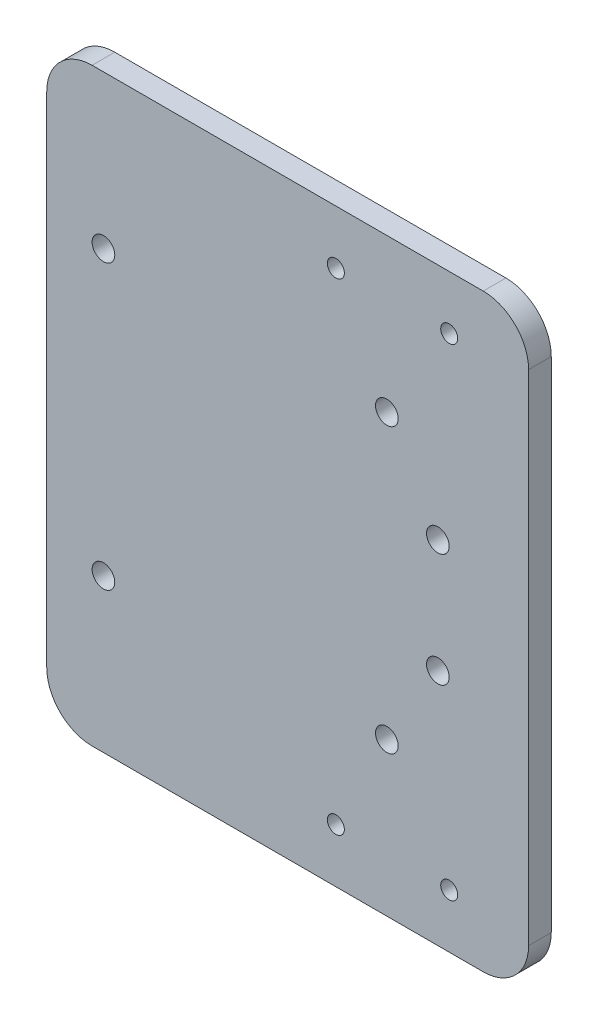
ISO-10303-21;
HEADER;
FILE_DESCRIPTION(('STEP AP214'),'2;1');
FILE_NAME('part.step','',(''),(''),'','','');
FILE_SCHEMA(('AUTOMOTIVE_DESIGN { 1 0 10303 214 1 1 1 1 }'));
ENDSEC;
DATA;
#1=APPLICATION_CONTEXT('core data for automotive mechanical design processes');
#2=APPLICATION_PROTOCOL_DEFINITION('international standard','automotive_design',2000,#1);
#3=PRODUCT_CONTEXT('',#1,'mechanical');
#4=PRODUCT('Part','Part','',(#3));
#5=PRODUCT_RELATED_PRODUCT_CATEGORY('part','',(#4));
#6=PRODUCT_DEFINITION_FORMATION('','',#4);
#7=PRODUCT_DEFINITION_CONTEXT('part definition',#1,'design');
#8=PRODUCT_DEFINITION('design','',#6,#7);
#9=PRODUCT_DEFINITION_SHAPE('','',#8);
#10=(LENGTH_UNIT() NAMED_UNIT(*) SI_UNIT(.MILLI.,.METRE.));
#11=(NAMED_UNIT(*) PLANE_ANGLE_UNIT() SI_UNIT($,.RADIAN.));
#12=(NAMED_UNIT(*) SI_UNIT($,.STERADIAN.) SOLID_ANGLE_UNIT());
#13=UNCERTAINTY_MEASURE_WITH_UNIT(LENGTH_MEASURE(1.E-05),#10,'distance_accuracy_value','');
#14=(GEOMETRIC_REPRESENTATION_CONTEXT(3) GLOBAL_UNCERTAINTY_ASSIGNED_CONTEXT((#13)) GLOBAL_UNIT_ASSIGNED_CONTEXT((#10,
#11,#12)) REPRESENTATION_CONTEXT('',''));
#15=CARTESIAN_POINT('',(0.,0.,0.));
#16=DIRECTION('',(0.,0.,1.));
#17=DIRECTION('',(1.,0.,0.));
#18=AXIS2_PLACEMENT_3D('',#15,#16,#17);
#19=CARTESIAN_POINT('',(28.8997114117527,0.,4.));
#20=DIRECTION('',(1.,0.,0.));
#21=DIRECTION('',(0.,1.,0.));
#22=AXIS2_PLACEMENT_3D('',#19,#20,#21);
#23=PLANE('',#22);
#24=DIRECTION('',(0.,-1.,0.));
#25=VECTOR('',#24,1.);
#26=CARTESIAN_POINT('',(28.8997114117527,0.,4.));
#27=LINE('',#26,#25);
#28=CARTESIAN_POINT('',(28.8997114117527,33.4797256667239,4.));
#29=VERTEX_POINT('',#28);
#30=CARTESIAN_POINT('',(28.8997114117527,-54.520274333276,4.));
#31=VERTEX_POINT('',#30);
#32=EDGE_CURVE('E163',#29,#31,#27,.T.);
#33=ORIENTED_EDGE('',*,*,#32,.T.);
#34=DIRECTION('',(0.,0.,-1.));
#35=VECTOR('',#34,1.);
#36=CARTESIAN_POINT('',(28.8997114117527,-54.520274333276,0.));
#37=LINE('',#36,#35);
#38=CARTESIAN_POINT('',(28.8997114117527,-54.520274333276,0.));
#39=VERTEX_POINT('',#38);
#40=EDGE_CURVE('E155',#31,#39,#37,.T.);
#41=ORIENTED_EDGE('',*,*,#40,.T.);
#42=DIRECTION('',(0.,-1.,0.));
#43=VECTOR('',#42,1.);
#44=CARTESIAN_POINT('',(28.8997114117527,0.,0.));
#45=LINE('',#44,#43);
#46=CARTESIAN_POINT('',(28.8997114117527,33.4797256667239,0.));
#47=VERTEX_POINT('',#46);
#48=EDGE_CURVE('E161',#47,#39,#45,.T.);
#49=ORIENTED_EDGE('',*,*,#48,.F.);
#50=DIRECTION('',(0.,0.,-1.));
#51=VECTOR('',#50,1.);
#52=CARTESIAN_POINT('',(28.8997114117527,33.4797256667239,4.));
#53=LINE('',#52,#51);
#54=EDGE_CURVE('E153',#47,#29,#53,.F.);
#55=ORIENTED_EDGE('',*,*,#54,.T.);
#56=EDGE_LOOP('',(#33,#41,#49,#55));
#57=FACE_BOUND('',#56,.T.);
#58=ADVANCED_FACE('F36',(#57),#23,.T.);
#59=CARTESIAN_POINT('',(0.,41.4797256667239,4.));
#60=DIRECTION('',(0.,1.,0.));
#61=DIRECTION('',(0.,0.,1.));
#62=AXIS2_PLACEMENT_3D('',#59,#60,#61);
#63=PLANE('',#62);
#64=DIRECTION('',(1.,0.,0.));
#65=VECTOR('',#64,1.);
#66=CARTESIAN_POINT('',(0.,41.4797256667239,4.));
#67=LINE('',#66,#65);
#68=CARTESIAN_POINT('',(-48.1002885882473,41.4797256667239,4.));
#69=VERTEX_POINT('',#68);
#70=CARTESIAN_POINT('',(20.8997114117527,41.4797256667239,4.));
#71=VERTEX_POINT('',#70);
#72=EDGE_CURVE('E203',#69,#71,#67,.T.);
#73=ORIENTED_EDGE('',*,*,#72,.T.);
#74=DIRECTION('',(0.,0.,-1.));
#75=VECTOR('',#74,1.);
#76=CARTESIAN_POINT('',(20.8997114117527,41.4797256667239,4.));
#77=LINE('',#76,#75);
#78=CARTESIAN_POINT('',(20.8997114117527,41.4797256667239,0.));
#79=VERTEX_POINT('',#78);
#80=EDGE_CURVE('E11',#71,#79,#77,.T.);
#81=ORIENTED_EDGE('',*,*,#80,.T.);
#82=DIRECTION('',(1.,0.,0.));
#83=VECTOR('',#82,1.);
#84=CARTESIAN_POINT('',(0.,41.4797256667239,0.));
#85=LINE('',#84,#83);
#86=CARTESIAN_POINT('',(-48.1002885882473,41.4797256667239,0.));
#87=VERTEX_POINT('',#86);
#88=EDGE_CURVE('E134',#87,#79,#85,.T.);
#89=ORIENTED_EDGE('',*,*,#88,.F.);
#90=DIRECTION('',(0.,0.,-1.));
#91=VECTOR('',#90,1.);
#92=CARTESIAN_POINT('',(-48.1002885882473,41.4797256667239,4.));
#93=LINE('',#92,#91);
#94=EDGE_CURVE('E44',#87,#69,#93,.F.);
#95=ORIENTED_EDGE('',*,*,#94,.T.);
#96=EDGE_LOOP('',(#73,#81,#89,#95));
#97=FACE_BOUND('',#96,.T.);
#98=ADVANCED_FACE('F262',(#97),#63,.T.);
#99=CARTESIAN_POINT('',(-56.1002885882473,0.,4.));
#100=DIRECTION('',(1.,0.,0.));
#101=DIRECTION('',(0.,0.,-1.));
#102=AXIS2_PLACEMENT_3D('',#99,#100,#101);
#103=PLANE('',#102);
#104=DIRECTION('',(0.,-1.,0.));
#105=VECTOR('',#104,1.);
#106=CARTESIAN_POINT('',(-56.1002885882473,0.,0.));
#107=LINE('',#106,#105);
#108=CARTESIAN_POINT('',(-56.1002885882473,33.4797256667239,0.));
#109=VERTEX_POINT('',#108);
#110=CARTESIAN_POINT('',(-56.1002885882473,-54.520274333276,0.));
#111=VERTEX_POINT('',#110);
#112=EDGE_CURVE('E129',#109,#111,#107,.T.);
#113=ORIENTED_EDGE('',*,*,#112,.T.);
#114=DIRECTION('',(0.,0.,-1.));
#115=VECTOR('',#114,1.);
#116=CARTESIAN_POINT('',(-56.1002885882473,-54.520274333276,4.));
#117=LINE('',#116,#115);
#118=CARTESIAN_POINT('',(-56.1002885882473,-54.520274333276,4.));
#119=VERTEX_POINT('',#118);
#120=EDGE_CURVE('E107',#111,#119,#117,.F.);
#121=ORIENTED_EDGE('',*,*,#120,.T.);
#122=DIRECTION('',(0.,-1.,0.));
#123=VECTOR('',#122,1.);
#124=CARTESIAN_POINT('',(-56.1002885882473,0.,4.));
#125=LINE('',#124,#123);
#126=CARTESIAN_POINT('',(-56.1002885882473,33.4797256667239,4.));
#127=VERTEX_POINT('',#126);
#128=EDGE_CURVE('E200',#127,#119,#125,.T.);
#129=ORIENTED_EDGE('',*,*,#128,.F.);
#130=DIRECTION('',(0.,0.,-1.));
#131=VECTOR('',#130,1.);
#132=CARTESIAN_POINT('',(-56.1002885882473,33.4797256667239,0.));
#133=LINE('',#132,#131);
#134=EDGE_CURVE('E112',#127,#109,#133,.T.);
#135=ORIENTED_EDGE('',*,*,#134,.T.);
#136=EDGE_LOOP('',(#113,#121,#129,#135));
#137=FACE_BOUND('',#136,.T.);
#138=ADVANCED_FACE('F260',(#137),#103,.F.);
#139=CARTESIAN_POINT('',(-5.10028858824732,31.979725666724,4.));
#140=DIRECTION('',(0.,0.,-1.));
#141=DIRECTION('',(-1.,0.,0.));
#142=AXIS2_PLACEMENT_3D('',#139,#140,#141);
#143=CYLINDRICAL_SURFACE('',#142,1.5);
#144=CARTESIAN_POINT('',(-5.10028858824732,31.979725666724,4.));
#145=DIRECTION('',(0.,0.,1.));
#146=DIRECTION('',(1.,0.,0.));
#147=AXIS2_PLACEMENT_3D('',#144,#145,#146);
#148=CIRCLE('',#147,1.5);
#149=CARTESIAN_POINT('',(-3.60028858824732,31.979725666724,4.));
#150=VERTEX_POINT('',#149);
#151=EDGE_CURVE('E206',#150,#150,#148,.T.);
#152=ORIENTED_EDGE('',*,*,#151,.T.);
#153=EDGE_LOOP('',(#152));
#154=FACE_BOUND('',#153,.T.);
#155=CARTESIAN_POINT('',(-5.10028858824732,31.979725666724,0.));
#156=DIRECTION('',(0.,0.,1.));
#157=DIRECTION('',(1.,0.,0.));
#158=AXIS2_PLACEMENT_3D('',#155,#156,#157);
#159=CIRCLE('',#158,1.5);
#160=CARTESIAN_POINT('',(-3.60028858824732,31.979725666724,0.));
#161=VERTEX_POINT('',#160);
#162=EDGE_CURVE('E167',#161,#161,#159,.T.);
#163=ORIENTED_EDGE('',*,*,#162,.F.);
#164=EDGE_LOOP('',(#163));
#165=FACE_BOUND('',#164,.T.);
#166=ADVANCED_FACE('F282',(#154,#165),#143,.F.);
#167=CARTESIAN_POINT('',(12.8997114117527,-20.5202743332761,4.));
#168=DIRECTION('',(0.,0.,-1.));
#169=DIRECTION('',(-1.,0.,0.));
#170=AXIS2_PLACEMENT_3D('',#167,#168,#169);
#171=CYLINDRICAL_SURFACE('',#170,2.00000000000001);
#172=CARTESIAN_POINT('',(12.8997114117527,-20.5202743332761,4.));
#173=DIRECTION('',(0.,0.,1.));
#174=DIRECTION('',(1.,0.,0.));
#175=AXIS2_PLACEMENT_3D('',#172,#173,#174);
#176=CIRCLE('',#175,2.00000000000001);
#177=CARTESIAN_POINT('',(14.8997114117527,-20.5202743332761,4.));
#178=VERTEX_POINT('',#177);
#179=EDGE_CURVE('E209',#178,#178,#176,.T.);
#180=ORIENTED_EDGE('',*,*,#179,.T.);
#181=EDGE_LOOP('',(#180));
#182=FACE_BOUND('',#181,.T.);
#183=CARTESIAN_POINT('',(12.8997114117527,-20.5202743332761,0.));
#184=DIRECTION('',(0.,0.,1.));
#185=DIRECTION('',(1.,0.,0.));
#186=AXIS2_PLACEMENT_3D('',#183,#184,#185);
#187=CIRCLE('',#186,2.00000000000001);
#188=CARTESIAN_POINT('',(14.8997114117527,-20.5202743332761,0.));
#189=VERTEX_POINT('',#188);
#190=EDGE_CURVE('E170',#189,#189,#187,.T.);
#191=ORIENTED_EDGE('',*,*,#190,.F.);
#192=EDGE_LOOP('',(#191));
#193=FACE_BOUND('',#192,.T.);
#194=ADVANCED_FACE('F285',(#182,#193),#171,.F.);
#195=CARTESIAN_POINT('',(12.8997114117527,-0.520274333276057,4.));
#196=DIRECTION('',(0.,0.,-1.));
#197=DIRECTION('',(-1.,0.,0.));
#198=AXIS2_PLACEMENT_3D('',#195,#196,#197);
#199=CYLINDRICAL_SURFACE('',#198,2.00000000000001);
#200=CARTESIAN_POINT('',(12.8997114117527,-0.520274333276057,4.));
#201=DIRECTION('',(0.,0.,1.));
#202=DIRECTION('',(1.,0.,0.));
#203=AXIS2_PLACEMENT_3D('',#200,#201,#202);
#204=CIRCLE('',#203,2.00000000000001);
#205=CARTESIAN_POINT('',(14.8997114117527,-0.520274333276057,4.));
#206=VERTEX_POINT('',#205);
#207=EDGE_CURVE('E212',#206,#206,#204,.T.);
#208=ORIENTED_EDGE('',*,*,#207,.T.);
#209=EDGE_LOOP('',(#208));
#210=FACE_BOUND('',#209,.T.);
#211=CARTESIAN_POINT('',(12.8997114117527,-0.520274333276057,0.));
#212=DIRECTION('',(0.,0.,1.));
#213=DIRECTION('',(1.,0.,0.));
#214=AXIS2_PLACEMENT_3D('',#211,#212,#213);
#215=CIRCLE('',#214,2.00000000000001);
#216=CARTESIAN_POINT('',(14.8997114117527,-0.520274333276057,0.));
#217=VERTEX_POINT('',#216);
#218=EDGE_CURVE('E175',#217,#217,#215,.T.);
#219=ORIENTED_EDGE('',*,*,#218,.F.);
#220=EDGE_LOOP('',(#219));
#221=FACE_BOUND('',#220,.T.);
#222=ADVANCED_FACE('F289',(#210,#221),#199,.F.);
#223=CARTESIAN_POINT('',(14.8997114117527,31.979725666724,4.));
#224=DIRECTION('',(0.,0.,-1.));
#225=DIRECTION('',(-1.,0.,0.));
#226=AXIS2_PLACEMENT_3D('',#223,#224,#225);
#227=CYLINDRICAL_SURFACE('',#226,1.5);
#228=CARTESIAN_POINT('',(14.8997114117527,31.979725666724,4.));
#229=DIRECTION('',(0.,0.,1.));
#230=DIRECTION('',(1.,0.,0.));
#231=AXIS2_PLACEMENT_3D('',#228,#229,#230);
#232=CIRCLE('',#231,1.5);
#233=CARTESIAN_POINT('',(16.3997114117527,31.979725666724,4.));
#234=VERTEX_POINT('',#233);
#235=EDGE_CURVE('E215',#234,#234,#232,.T.);
#236=ORIENTED_EDGE('',*,*,#235,.T.);
#237=EDGE_LOOP('',(#236));
#238=FACE_BOUND('',#237,.T.);
#239=CARTESIAN_POINT('',(14.8997114117527,31.979725666724,0.));
#240=DIRECTION('',(0.,0.,1.));
#241=DIRECTION('',(1.,0.,0.));
#242=AXIS2_PLACEMENT_3D('',#239,#240,#241);
#243=CIRCLE('',#242,1.5);
#244=CARTESIAN_POINT('',(16.3997114117527,31.979725666724,0.));
#245=VERTEX_POINT('',#244);
#246=EDGE_CURVE('E178',#245,#245,#243,.T.);
#247=ORIENTED_EDGE('',*,*,#246,.F.);
#248=EDGE_LOOP('',(#247));
#249=FACE_BOUND('',#248,.T.);
#250=ADVANCED_FACE('F293',(#238,#249),#227,.F.);
#251=CARTESIAN_POINT('',(-46.1002885882473,14.479725666724,4.));
#252=DIRECTION('',(0.,0.,-1.));
#253=DIRECTION('',(-1.,0.,0.));
#254=AXIS2_PLACEMENT_3D('',#251,#252,#253);
#255=CYLINDRICAL_SURFACE('',#254,2.);
#256=CARTESIAN_POINT('',(-46.1002885882473,14.479725666724,4.));
#257=DIRECTION('',(0.,0.,1.));
#258=DIRECTION('',(1.,0.,0.));
#259=AXIS2_PLACEMENT_3D('',#256,#257,#258);
#260=CIRCLE('',#259,2.);
#261=CARTESIAN_POINT('',(-44.1002885882473,14.479725666724,4.));
#262=VERTEX_POINT('',#261);
#263=EDGE_CURVE('E218',#262,#262,#260,.T.);
#264=ORIENTED_EDGE('',*,*,#263,.T.);
#265=EDGE_LOOP('',(#264));
#266=FACE_BOUND('',#265,.T.);
#267=CARTESIAN_POINT('',(-46.1002885882473,14.479725666724,0.));
#268=DIRECTION('',(0.,0.,1.));
#269=DIRECTION('',(1.,0.,0.));
#270=AXIS2_PLACEMENT_3D('',#267,#268,#269);
#271=CIRCLE('',#270,2.);
#272=CARTESIAN_POINT('',(-44.1002885882473,14.479725666724,0.));
#273=VERTEX_POINT('',#272);
#274=EDGE_CURVE('E181',#273,#273,#271,.T.);
#275=ORIENTED_EDGE('',*,*,#274,.F.);
#276=EDGE_LOOP('',(#275));
#277=FACE_BOUND('',#276,.T.);
#278=ADVANCED_FACE('F297',(#266,#277),#255,.F.);
#279=CARTESIAN_POINT('',(-46.1002885882473,-35.520274333276,4.));
#280=DIRECTION('',(0.,0.,-1.));
#281=DIRECTION('',(-1.,0.,0.));
#282=AXIS2_PLACEMENT_3D('',#279,#280,#281);
#283=CYLINDRICAL_SURFACE('',#282,2.);
#284=CARTESIAN_POINT('',(-46.1002885882473,-35.520274333276,4.));
#285=DIRECTION('',(0.,0.,1.));
#286=DIRECTION('',(1.,0.,0.));
#287=AXIS2_PLACEMENT_3D('',#284,#285,#286);
#288=CIRCLE('',#287,2.);
#289=CARTESIAN_POINT('',(-44.1002885882473,-35.520274333276,4.));
#290=VERTEX_POINT('',#289);
#291=EDGE_CURVE('E221',#290,#290,#288,.T.);
#292=ORIENTED_EDGE('',*,*,#291,.T.);
#293=EDGE_LOOP('',(#292));
#294=FACE_BOUND('',#293,.T.);
#295=CARTESIAN_POINT('',(-46.1002885882473,-35.520274333276,0.));
#296=DIRECTION('',(0.,0.,1.));
#297=DIRECTION('',(1.,0.,0.));
#298=AXIS2_PLACEMENT_3D('',#295,#296,#297);
#299=CIRCLE('',#298,2.);
#300=CARTESIAN_POINT('',(-44.1002885882473,-35.520274333276,0.));
#301=VERTEX_POINT('',#300);
#302=EDGE_CURVE('E184',#301,#301,#299,.T.);
#303=ORIENTED_EDGE('',*,*,#302,.F.);
#304=EDGE_LOOP('',(#303));
#305=FACE_BOUND('',#304,.T.);
#306=ADVANCED_FACE('F301',(#294,#305),#283,.F.);
#307=CARTESIAN_POINT('',(-5.10028858824732,-53.0202743332761,4.));
#308=DIRECTION('',(0.,0.,-1.));
#309=DIRECTION('',(-1.,0.,0.));
#310=AXIS2_PLACEMENT_3D('',#307,#308,#309);
#311=CYLINDRICAL_SURFACE('',#310,1.5);
#312=CARTESIAN_POINT('',(-5.10028858824732,-53.0202743332761,4.));
#313=DIRECTION('',(0.,0.,1.));
#314=DIRECTION('',(1.,0.,0.));
#315=AXIS2_PLACEMENT_3D('',#312,#313,#314);
#316=CIRCLE('',#315,1.5);
#317=CARTESIAN_POINT('',(-3.60028858824732,-53.0202743332761,4.));
#318=VERTEX_POINT('',#317);
#319=EDGE_CURVE('E224',#318,#318,#316,.T.);
#320=ORIENTED_EDGE('',*,*,#319,.T.);
#321=EDGE_LOOP('',(#320));
#322=FACE_BOUND('',#321,.T.);
#323=CARTESIAN_POINT('',(-5.10028858824732,-53.0202743332761,0.));
#324=DIRECTION('',(0.,0.,1.));
#325=DIRECTION('',(1.,0.,0.));
#326=AXIS2_PLACEMENT_3D('',#323,#324,#325);
#327=CIRCLE('',#326,1.5);
#328=CARTESIAN_POINT('',(-3.60028858824732,-53.0202743332761,0.));
#329=VERTEX_POINT('',#328);
#330=EDGE_CURVE('E187',#329,#329,#327,.T.);
#331=ORIENTED_EDGE('',*,*,#330,.F.);
#332=EDGE_LOOP('',(#331));
#333=FACE_BOUND('',#332,.T.);
#334=ADVANCED_FACE('F305',(#322,#333),#311,.F.);
#335=CARTESIAN_POINT('',(14.8997114117527,-53.020274333276,4.));
#336=DIRECTION('',(0.,0.,-1.));
#337=DIRECTION('',(-1.,0.,0.));
#338=AXIS2_PLACEMENT_3D('',#335,#336,#337);
#339=CYLINDRICAL_SURFACE('',#338,1.5);
#340=CARTESIAN_POINT('',(14.8997114117527,-53.020274333276,4.));
#341=DIRECTION('',(0.,0.,1.));
#342=DIRECTION('',(1.,0.,0.));
#343=AXIS2_PLACEMENT_3D('',#340,#341,#342);
#344=CIRCLE('',#343,1.5);
#345=CARTESIAN_POINT('',(16.3997114117527,-53.020274333276,4.));
#346=VERTEX_POINT('',#345);
#347=EDGE_CURVE('E227',#346,#346,#344,.T.);
#348=ORIENTED_EDGE('',*,*,#347,.T.);
#349=EDGE_LOOP('',(#348));
#350=FACE_BOUND('',#349,.T.);
#351=CARTESIAN_POINT('',(14.8997114117527,-53.020274333276,0.));
#352=DIRECTION('',(0.,0.,1.));
#353=DIRECTION('',(1.,0.,0.));
#354=AXIS2_PLACEMENT_3D('',#351,#352,#353);
#355=CIRCLE('',#354,1.5);
#356=CARTESIAN_POINT('',(16.3997114117527,-53.020274333276,0.));
#357=VERTEX_POINT('',#356);
#358=EDGE_CURVE('E190',#357,#357,#355,.T.);
#359=ORIENTED_EDGE('',*,*,#358,.F.);
#360=EDGE_LOOP('',(#359));
#361=FACE_BOUND('',#360,.T.);
#362=ADVANCED_FACE('F309',(#350,#361),#339,.F.);
#363=CARTESIAN_POINT('',(3.89971141175268,-35.520274333276,4.));
#364=DIRECTION('',(0.,0.,-1.));
#365=DIRECTION('',(-1.,0.,0.));
#366=AXIS2_PLACEMENT_3D('',#363,#364,#365);
#367=CYLINDRICAL_SURFACE('',#366,2.00000000000001);
#368=CARTESIAN_POINT('',(3.89971141175268,-35.520274333276,4.));
#369=DIRECTION('',(0.,0.,1.));
#370=DIRECTION('',(1.,0.,0.));
#371=AXIS2_PLACEMENT_3D('',#368,#369,#370);
#372=CIRCLE('',#371,2.00000000000001);
#373=CARTESIAN_POINT('',(5.89971141175269,-35.520274333276,4.));
#374=VERTEX_POINT('',#373);
#375=EDGE_CURVE('E132',#374,#374,#372,.T.);
#376=ORIENTED_EDGE('',*,*,#375,.T.);
#377=EDGE_LOOP('',(#376));
#378=FACE_BOUND('',#377,.T.);
#379=CARTESIAN_POINT('',(3.89971141175268,-35.520274333276,0.));
#380=DIRECTION('',(0.,0.,1.));
#381=DIRECTION('',(1.,0.,0.));
#382=AXIS2_PLACEMENT_3D('',#379,#380,#381);
#383=CIRCLE('',#382,2.00000000000001);
#384=CARTESIAN_POINT('',(5.89971141175269,-35.520274333276,0.));
#385=VERTEX_POINT('',#384);
#386=EDGE_CURVE('E193',#385,#385,#383,.T.);
#387=ORIENTED_EDGE('',*,*,#386,.F.);
#388=EDGE_LOOP('',(#387));
#389=FACE_BOUND('',#388,.T.);
#390=ADVANCED_FACE('F233',(#378,#389),#367,.F.);
#391=CARTESIAN_POINT('',(3.89971141175268,14.479725666724,4.));
#392=DIRECTION('',(0.,0.,-1.));
#393=DIRECTION('',(-1.,0.,0.));
#394=AXIS2_PLACEMENT_3D('',#391,#392,#393);
#395=CYLINDRICAL_SURFACE('',#394,2.00000000000001);
#396=CARTESIAN_POINT('',(3.89971141175268,14.479725666724,4.));
#397=DIRECTION('',(0.,0.,1.));
#398=DIRECTION('',(1.,0.,0.));
#399=AXIS2_PLACEMENT_3D('',#396,#397,#398);
#400=CIRCLE('',#399,2.00000000000001);
#401=CARTESIAN_POINT('',(5.89971141175269,14.479725666724,4.));
#402=VERTEX_POINT('',#401);
#403=EDGE_CURVE('E128',#402,#402,#400,.T.);
#404=ORIENTED_EDGE('',*,*,#403,.T.);
#405=EDGE_LOOP('',(#404));
#406=FACE_BOUND('',#405,.T.);
#407=CARTESIAN_POINT('',(3.89971141175268,14.479725666724,0.));
#408=DIRECTION('',(0.,0.,1.));
#409=DIRECTION('',(1.,0.,0.));
#410=AXIS2_PLACEMENT_3D('',#407,#408,#409);
#411=CIRCLE('',#410,2.00000000000001);
#412=CARTESIAN_POINT('',(5.89971141175269,14.479725666724,0.));
#413=VERTEX_POINT('',#412);
#414=EDGE_CURVE('E196',#413,#413,#411,.T.);
#415=ORIENTED_EDGE('',*,*,#414,.F.);
#416=EDGE_LOOP('',(#415));
#417=FACE_BOUND('',#416,.T.);
#418=ADVANCED_FACE('F316',(#406,#417),#395,.F.);
#419=CARTESIAN_POINT('',(0.,-62.520274333276,4.));
#420=DIRECTION('',(0.,1.,0.));
#421=DIRECTION('',(0.,0.,1.));
#422=AXIS2_PLACEMENT_3D('',#419,#420,#421);
#423=PLANE('',#422);
#424=DIRECTION('',(1.,0.,0.));
#425=VECTOR('',#424,1.);
#426=CARTESIAN_POINT('',(0.,-62.520274333276,4.));
#427=LINE('',#426,#425);
#428=CARTESIAN_POINT('',(-48.1002885882473,-62.520274333276,4.));
#429=VERTEX_POINT('',#428);
#430=CARTESIAN_POINT('',(20.8997114117527,-62.520274333276,4.));
#431=VERTEX_POINT('',#430);
#432=EDGE_CURVE('E122',#429,#431,#427,.T.);
#433=ORIENTED_EDGE('',*,*,#432,.F.);
#434=DIRECTION('',(0.,0.,-1.));
#435=VECTOR('',#434,1.);
#436=CARTESIAN_POINT('',(-48.1002885882473,-62.520274333276,4.));
#437=LINE('',#436,#435);
#438=CARTESIAN_POINT('',(-48.1002885882473,-62.520274333276,0.));
#439=VERTEX_POINT('',#438);
#440=EDGE_CURVE('E106',#429,#439,#437,.T.);
#441=ORIENTED_EDGE('',*,*,#440,.T.);
#442=DIRECTION('',(1.,0.,0.));
#443=VECTOR('',#442,1.);
#444=CARTESIAN_POINT('',(0.,-62.520274333276,0.));
#445=LINE('',#444,#443);
#446=CARTESIAN_POINT('',(20.8997114117527,-62.520274333276,0.));
#447=VERTEX_POINT('',#446);
#448=EDGE_CURVE('E119',#439,#447,#445,.T.);
#449=ORIENTED_EDGE('',*,*,#448,.T.);
#450=DIRECTION('',(0.,0.,-1.));
#451=VECTOR('',#450,1.);
#452=CARTESIAN_POINT('',(20.8997114117527,-62.520274333276,4.));
#453=LINE('',#452,#451);
#454=EDGE_CURVE('E124',#447,#431,#453,.F.);
#455=ORIENTED_EDGE('',*,*,#454,.T.);
#456=EDGE_LOOP('',(#433,#441,#449,#455));
#457=FACE_BOUND('',#456,.T.);
#458=ADVANCED_FACE('F118',(#457),#423,.F.);
#459=CARTESIAN_POINT('',(0.,0.,4.));
#460=DIRECTION('',(0.,0.,1.));
#461=DIRECTION('',(1.,0.,0.));
#462=AXIS2_PLACEMENT_3D('',#459,#460,#461);
#463=PLANE('',#462);
#464=ORIENTED_EDGE('',*,*,#403,.F.);
#465=EDGE_LOOP('',(#464));
#466=FACE_BOUND('',#465,.T.);
#467=ORIENTED_EDGE('',*,*,#375,.F.);
#468=EDGE_LOOP('',(#467));
#469=FACE_BOUND('',#468,.T.);
#470=ORIENTED_EDGE('',*,*,#347,.F.);
#471=EDGE_LOOP('',(#470));
#472=FACE_BOUND('',#471,.T.);
#473=ORIENTED_EDGE('',*,*,#319,.F.);
#474=EDGE_LOOP('',(#473));
#475=FACE_BOUND('',#474,.T.);
#476=ORIENTED_EDGE('',*,*,#291,.F.);
#477=EDGE_LOOP('',(#476));
#478=FACE_BOUND('',#477,.T.);
#479=ORIENTED_EDGE('',*,*,#263,.F.);
#480=EDGE_LOOP('',(#479));
#481=FACE_BOUND('',#480,.T.);
#482=ORIENTED_EDGE('',*,*,#235,.F.);
#483=EDGE_LOOP('',(#482));
#484=FACE_BOUND('',#483,.T.);
#485=ORIENTED_EDGE('',*,*,#207,.F.);
#486=EDGE_LOOP('',(#485));
#487=FACE_BOUND('',#486,.T.);
#488=ORIENTED_EDGE('',*,*,#179,.F.);
#489=EDGE_LOOP('',(#488));
#490=FACE_BOUND('',#489,.T.);
#491=ORIENTED_EDGE('',*,*,#151,.F.);
#492=EDGE_LOOP('',(#491));
#493=FACE_BOUND('',#492,.T.);
#494=ORIENTED_EDGE('',*,*,#128,.T.);
#495=CARTESIAN_POINT('',(-48.1002885882473,-54.520274333276,4.));
#496=DIRECTION('',(0.,0.,1.));
#497=DIRECTION('',(1.,0.,0.));
#498=AXIS2_PLACEMENT_3D('',#495,#496,#497);
#499=CIRCLE('',#498,8.);
#500=EDGE_CURVE('E151',#119,#429,#499,.T.);
#501=ORIENTED_EDGE('',*,*,#500,.T.);
#502=ORIENTED_EDGE('',*,*,#432,.T.);
#503=CARTESIAN_POINT('',(20.8997114117527,-54.520274333276,4.));
#504=DIRECTION('',(0.,0.,1.));
#505=DIRECTION('',(1.,0.,0.));
#506=AXIS2_PLACEMENT_3D('',#503,#504,#505);
#507=CIRCLE('',#506,8.);
#508=EDGE_CURVE('E149',#431,#31,#507,.T.);
#509=ORIENTED_EDGE('',*,*,#508,.T.);
#510=ORIENTED_EDGE('',*,*,#32,.F.);
#511=CARTESIAN_POINT('',(20.8997114117527,33.4797256667239,4.));
#512=DIRECTION('',(0.,0.,1.));
#513=DIRECTION('',(1.,0.,0.));
#514=AXIS2_PLACEMENT_3D('',#511,#512,#513);
#515=CIRCLE('',#514,8.);
#516=EDGE_CURVE('E51',#29,#71,#515,.T.);
#517=ORIENTED_EDGE('',*,*,#516,.T.);
#518=ORIENTED_EDGE('',*,*,#72,.F.);
#519=CARTESIAN_POINT('',(-48.1002885882473,33.4797256667239,4.));
#520=DIRECTION('',(0.,0.,1.));
#521=DIRECTION('',(1.,0.,0.));
#522=AXIS2_PLACEMENT_3D('',#519,#520,#521);
#523=CIRCLE('',#522,8.);
#524=EDGE_CURVE('E146',#69,#127,#523,.T.);
#525=ORIENTED_EDGE('',*,*,#524,.T.);
#526=EDGE_LOOP('',(#494,#501,#502,#509,#510,#517,#518,#525));
#527=FACE_BOUND('',#526,.T.);
#528=ADVANCED_FACE('F236',(#466,#469,#472,#475,#478,#481,#484,#487,#490,#493,#527),#463,.T.);
#529=CARTESIAN_POINT('',(0.,0.,0.));
#530=DIRECTION('',(0.,0.,1.));
#531=DIRECTION('',(1.,0.,0.));
#532=AXIS2_PLACEMENT_3D('',#529,#530,#531);
#533=PLANE('',#532);
#534=ORIENTED_EDGE('',*,*,#414,.T.);
#535=EDGE_LOOP('',(#534));
#536=FACE_BOUND('',#535,.T.);
#537=ORIENTED_EDGE('',*,*,#386,.T.);
#538=EDGE_LOOP('',(#537));
#539=FACE_BOUND('',#538,.T.);
#540=ORIENTED_EDGE('',*,*,#358,.T.);
#541=EDGE_LOOP('',(#540));
#542=FACE_BOUND('',#541,.T.);
#543=ORIENTED_EDGE('',*,*,#330,.T.);
#544=EDGE_LOOP('',(#543));
#545=FACE_BOUND('',#544,.T.);
#546=ORIENTED_EDGE('',*,*,#302,.T.);
#547=EDGE_LOOP('',(#546));
#548=FACE_BOUND('',#547,.T.);
#549=ORIENTED_EDGE('',*,*,#274,.T.);
#550=EDGE_LOOP('',(#549));
#551=FACE_BOUND('',#550,.T.);
#552=ORIENTED_EDGE('',*,*,#246,.T.);
#553=EDGE_LOOP('',(#552));
#554=FACE_BOUND('',#553,.T.);
#555=ORIENTED_EDGE('',*,*,#218,.T.);
#556=EDGE_LOOP('',(#555));
#557=FACE_BOUND('',#556,.T.);
#558=ORIENTED_EDGE('',*,*,#190,.T.);
#559=EDGE_LOOP('',(#558));
#560=FACE_BOUND('',#559,.T.);
#561=ORIENTED_EDGE('',*,*,#162,.T.);
#562=EDGE_LOOP('',(#561));
#563=FACE_BOUND('',#562,.T.);
#564=ORIENTED_EDGE('',*,*,#448,.F.);
#565=CARTESIAN_POINT('',(-48.1002885882473,-54.520274333276,0.));
#566=DIRECTION('',(0.,0.,1.));
#567=DIRECTION('',(1.,0.,0.));
#568=AXIS2_PLACEMENT_3D('',#565,#566,#567);
#569=CIRCLE('',#568,8.);
#570=EDGE_CURVE('E102',#439,#111,#569,.F.);
#571=ORIENTED_EDGE('',*,*,#570,.T.);
#572=ORIENTED_EDGE('',*,*,#112,.F.);
#573=CARTESIAN_POINT('',(-48.1002885882473,33.4797256667239,0.));
#574=DIRECTION('',(0.,0.,1.));
#575=DIRECTION('',(1.,0.,0.));
#576=AXIS2_PLACEMENT_3D('',#573,#574,#575);
#577=CIRCLE('',#576,8.);
#578=EDGE_CURVE('E123',#109,#87,#577,.F.);
#579=ORIENTED_EDGE('',*,*,#578,.T.);
#580=ORIENTED_EDGE('',*,*,#88,.T.);
#581=CARTESIAN_POINT('',(20.8997114117527,33.4797256667239,0.));
#582=DIRECTION('',(0.,0.,1.));
#583=DIRECTION('',(1.,0.,0.));
#584=AXIS2_PLACEMENT_3D('',#581,#582,#583);
#585=CIRCLE('',#584,8.);
#586=EDGE_CURVE('E140',#79,#47,#585,.F.);
#587=ORIENTED_EDGE('',*,*,#586,.T.);
#588=ORIENTED_EDGE('',*,*,#48,.T.);
#589=CARTESIAN_POINT('',(20.8997114117527,-54.520274333276,0.));
#590=DIRECTION('',(0.,0.,1.));
#591=DIRECTION('',(1.,0.,0.));
#592=AXIS2_PLACEMENT_3D('',#589,#590,#591);
#593=CIRCLE('',#592,8.);
#594=EDGE_CURVE('E113',#39,#447,#593,.F.);
#595=ORIENTED_EDGE('',*,*,#594,.T.);
#596=EDGE_LOOP('',(#564,#571,#572,#579,#580,#587,#588,#595));
#597=FACE_BOUND('',#596,.T.);
#598=ADVANCED_FACE('F126',(#536,#539,#542,#545,#548,#551,#554,#557,#560,#563,#597),#533,.F.);
#599=CARTESIAN_POINT('',(-48.1002885882473,-54.520274333276,4.));
#600=DIRECTION('',(0.,0.,-1.));
#601=DIRECTION('',(-1.,0.,0.));
#602=AXIS2_PLACEMENT_3D('',#599,#600,#601);
#603=CYLINDRICAL_SURFACE('',#602,8.);
#604=ORIENTED_EDGE('',*,*,#500,.F.);
#605=ORIENTED_EDGE('',*,*,#120,.F.);
#606=ORIENTED_EDGE('',*,*,#570,.F.);
#607=ORIENTED_EDGE('',*,*,#440,.F.);
#608=EDGE_LOOP('',(#604,#605,#606,#607));
#609=FACE_BOUND('',#608,.T.);
#610=ADVANCED_FACE('F105',(#609),#603,.T.);
#611=CARTESIAN_POINT('',(20.8997114117527,-54.520274333276,4.));
#612=DIRECTION('',(0.,0.,1.));
#613=DIRECTION('',(1.,0.,0.));
#614=AXIS2_PLACEMENT_3D('',#611,#612,#613);
#615=CYLINDRICAL_SURFACE('',#614,8.);
#616=ORIENTED_EDGE('',*,*,#508,.F.);
#617=ORIENTED_EDGE('',*,*,#454,.F.);
#618=ORIENTED_EDGE('',*,*,#594,.F.);
#619=ORIENTED_EDGE('',*,*,#40,.F.);
#620=EDGE_LOOP('',(#616,#617,#618,#619));
#621=FACE_BOUND('',#620,.T.);
#622=ADVANCED_FACE('F266',(#621),#615,.T.);
#623=CARTESIAN_POINT('',(20.8997114117527,33.4797256667239,4.));
#624=DIRECTION('',(0.,0.,-1.));
#625=DIRECTION('',(-1.,0.,0.));
#626=AXIS2_PLACEMENT_3D('',#623,#624,#625);
#627=CYLINDRICAL_SURFACE('',#626,8.);
#628=ORIENTED_EDGE('',*,*,#516,.F.);
#629=ORIENTED_EDGE('',*,*,#54,.F.);
#630=ORIENTED_EDGE('',*,*,#586,.F.);
#631=ORIENTED_EDGE('',*,*,#80,.F.);
#632=EDGE_LOOP('',(#628,#629,#630,#631));
#633=FACE_BOUND('',#632,.T.);
#634=ADVANCED_FACE('F265',(#633),#627,.T.);
#635=CARTESIAN_POINT('',(-48.1002885882473,33.4797256667239,4.));
#636=DIRECTION('',(0.,0.,1.));
#637=DIRECTION('',(1.,0.,0.));
#638=AXIS2_PLACEMENT_3D('',#635,#636,#637);
#639=CYLINDRICAL_SURFACE('',#638,8.);
#640=ORIENTED_EDGE('',*,*,#524,.F.);
#641=ORIENTED_EDGE('',*,*,#94,.F.);
#642=ORIENTED_EDGE('',*,*,#578,.F.);
#643=ORIENTED_EDGE('',*,*,#134,.F.);
#644=EDGE_LOOP('',(#640,#641,#642,#643));
#645=FACE_BOUND('',#644,.T.);
#646=ADVANCED_FACE('F38',(#645),#639,.T.);
#647=CLOSED_SHELL('',(#58,#98,#138,#166,#194,#222,#250,#278,#306,#334,#362,#390,#418,#458,#528,
#598,#610,#622,#634,#646));
#648=MANIFOLD_SOLID_BREP('B2',#647);
#649=ADVANCED_BREP_SHAPE_REPRESENTATION('',(#18,#648),#14);
#650=SHAPE_DEFINITION_REPRESENTATION(#9,#649);
ENDSEC;
END-ISO-10303-21;
